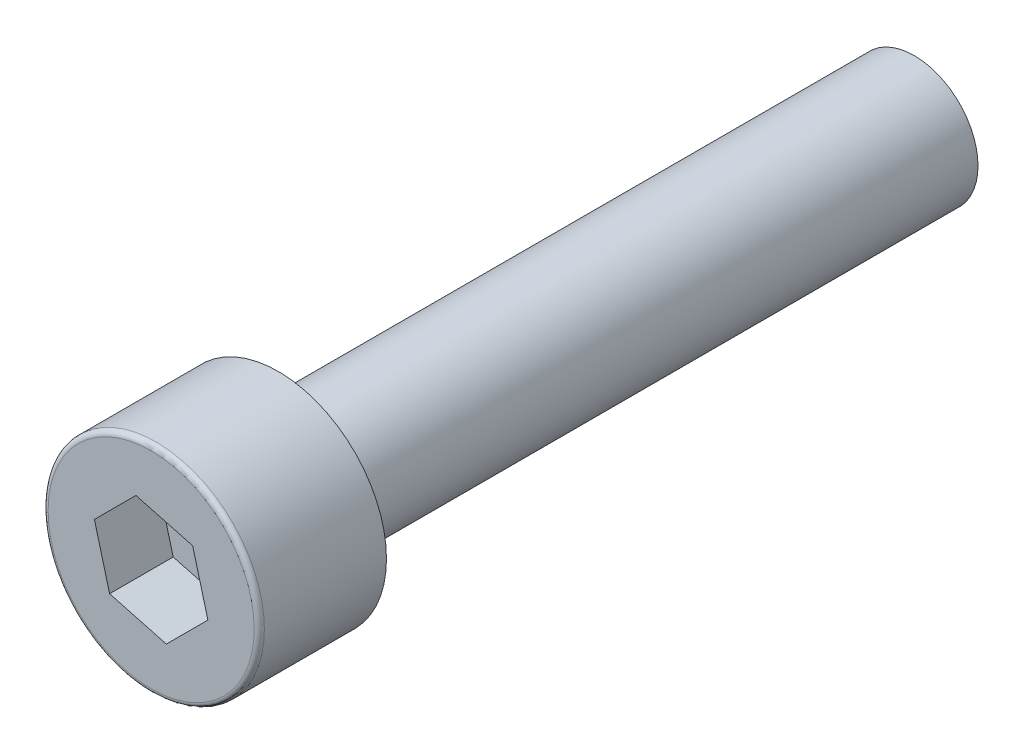
ISO-10303-21;
HEADER;
FILE_DESCRIPTION(('STEP AP214'),'2;1');
FILE_NAME('part.step','',(''),(''),'','','');
FILE_SCHEMA(('AUTOMOTIVE_DESIGN { 1 0 10303 214 1 1 1 1 }'));
ENDSEC;
DATA;
#1=APPLICATION_CONTEXT('core data for automotive mechanical design processes');
#2=APPLICATION_PROTOCOL_DEFINITION('international standard','automotive_design',2000,#1);
#3=PRODUCT_CONTEXT('',#1,'mechanical');
#4=PRODUCT('Part','Part','',(#3));
#5=PRODUCT_RELATED_PRODUCT_CATEGORY('part','',(#4));
#6=PRODUCT_DEFINITION_FORMATION('','',#4);
#7=PRODUCT_DEFINITION_CONTEXT('part definition',#1,'design');
#8=PRODUCT_DEFINITION('design','',#6,#7);
#9=PRODUCT_DEFINITION_SHAPE('','',#8);
#10=(LENGTH_UNIT() NAMED_UNIT(*) SI_UNIT(.MILLI.,.METRE.));
#11=(NAMED_UNIT(*) PLANE_ANGLE_UNIT() SI_UNIT($,.RADIAN.));
#12=(NAMED_UNIT(*) SI_UNIT($,.STERADIAN.) SOLID_ANGLE_UNIT());
#13=UNCERTAINTY_MEASURE_WITH_UNIT(LENGTH_MEASURE(1.E-05),#10,'distance_accuracy_value','');
#14=(GEOMETRIC_REPRESENTATION_CONTEXT(3) GLOBAL_UNCERTAINTY_ASSIGNED_CONTEXT((#13)) GLOBAL_UNIT_ASSIGNED_CONTEXT((#10,
#11,#12)) REPRESENTATION_CONTEXT('',''));
#15=CARTESIAN_POINT('',(0.,0.,0.));
#16=DIRECTION('',(0.,0.,1.));
#17=DIRECTION('',(1.,0.,0.));
#18=AXIS2_PLACEMENT_3D('',#15,#16,#17);
#19=CARTESIAN_POINT('',(0.,0.,0.));
#20=DIRECTION('',(0.,0.,1.));
#21=DIRECTION('',(1.,0.,0.));
#22=AXIS2_PLACEMENT_3D('',#19,#20,#21);
#23=PLANE('',#22);
#24=CARTESIAN_POINT('',(0.,0.,0.));
#25=DIRECTION('',(0.,0.,1.));
#26=DIRECTION('',(1.,0.,0.));
#27=AXIS2_PLACEMENT_3D('',#24,#25,#26);
#28=CIRCLE('',#27,4.25);
#29=CARTESIAN_POINT('',(4.25,0.,0.));
#30=VERTEX_POINT('',#29);
#31=EDGE_CURVE('E137',#30,#30,#28,.T.);
#32=ORIENTED_EDGE('',*,*,#31,.F.);
#33=EDGE_LOOP('',(#32));
#34=FACE_BOUND('',#33,.T.);
#35=CARTESIAN_POINT('',(0.,0.,0.));
#36=DIRECTION('',(0.,0.,1.));
#37=DIRECTION('',(1.,0.,0.));
#38=AXIS2_PLACEMENT_3D('',#35,#36,#37);
#39=CIRCLE('',#38,2.5);
#40=CARTESIAN_POINT('',(2.5,0.,0.));
#41=VERTEX_POINT('',#40);
#42=EDGE_CURVE('E145',#41,#41,#39,.F.);
#43=ORIENTED_EDGE('',*,*,#42,.F.);
#44=EDGE_LOOP('',(#43));
#45=FACE_BOUND('',#44,.T.);
#46=ADVANCED_FACE('F34',(#34,#45),#23,.F.);
#47=CARTESIAN_POINT('',(0.,0.,5.));
#48=DIRECTION('',(0.,0.,-1.));
#49=DIRECTION('',(-1.,0.,0.));
#50=AXIS2_PLACEMENT_3D('',#47,#48,#49);
#51=CYLINDRICAL_SURFACE('',#50,4.25);
#52=CARTESIAN_POINT('',(0.,0.,4.8));
#53=DIRECTION('',(0.,0.,1.));
#54=DIRECTION('',(1.,0.,0.));
#55=AXIS2_PLACEMENT_3D('',#52,#53,#54);
#56=CIRCLE('',#55,4.25);
#57=CARTESIAN_POINT('',(4.25,0.,4.8));
#58=VERTEX_POINT('',#57);
#59=EDGE_CURVE('E11',#58,#58,#56,.F.);
#60=ORIENTED_EDGE('',*,*,#59,.T.);
#61=EDGE_LOOP('',(#60));
#62=FACE_BOUND('',#61,.T.);
#63=ORIENTED_EDGE('',*,*,#31,.T.);
#64=EDGE_LOOP('',(#63));
#65=FACE_BOUND('',#64,.T.);
#66=ADVANCED_FACE('F164',(#62,#65),#51,.T.);
#67=CARTESIAN_POINT('',(0.,0.,5.));
#68=DIRECTION('',(0.,0.,1.));
#69=DIRECTION('',(1.,0.,0.));
#70=AXIS2_PLACEMENT_3D('',#67,#68,#69);
#71=PLANE('',#70);
#72=CARTESIAN_POINT('',(0.,0.,5.));
#73=DIRECTION('',(0.,0.,1.));
#74=DIRECTION('',(1.,0.,0.));
#75=AXIS2_PLACEMENT_3D('',#72,#73,#74);
#76=CIRCLE('',#75,4.05);
#77=CARTESIAN_POINT('',(4.05,0.,5.));
#78=VERTEX_POINT('',#77);
#79=EDGE_CURVE('E42',#78,#78,#76,.T.);
#80=ORIENTED_EDGE('',*,*,#79,.T.);
#81=EDGE_LOOP('',(#80));
#82=FACE_BOUND('',#81,.T.);
#83=DIRECTION('',(0.258819045102521,-0.965925826289068,0.));
#84=VECTOR('',#83,1.);
#85=CARTESIAN_POINT('',(-2.23071014330082,0.597716981445369,5.));
#86=LINE('',#85,#84);
#87=CARTESIAN_POINT('',(-2.23071014330082,0.597716981445369,5.));
#88=VERTEX_POINT('',#87);
#89=CARTESIAN_POINT('',(-1.63299316185545,-1.63299316185545,5.));
#90=VERTEX_POINT('',#89);
#91=EDGE_CURVE('E49',#88,#90,#86,.T.);
#92=ORIENTED_EDGE('',*,*,#91,.F.);
#93=DIRECTION('',(-0.707106781186547,-0.707106781186548,0.));
#94=VECTOR('',#93,1.);
#95=CARTESIAN_POINT('',(-0.597716981445369,2.23071014330082,5.));
#96=LINE('',#95,#94);
#97=CARTESIAN_POINT('',(-0.597716981445369,2.23071014330082,5.));
#98=VERTEX_POINT('',#97);
#99=EDGE_CURVE('E133',#98,#88,#96,.T.);
#100=ORIENTED_EDGE('',*,*,#99,.F.);
#101=DIRECTION('',(-0.965925826289068,0.258819045102521,0.));
#102=VECTOR('',#101,1.);
#103=CARTESIAN_POINT('',(1.63299316185545,1.63299316185545,5.));
#104=LINE('',#103,#102);
#105=CARTESIAN_POINT('',(1.63299316185545,1.63299316185545,5.));
#106=VERTEX_POINT('',#105);
#107=EDGE_CURVE('E131',#106,#98,#104,.T.);
#108=ORIENTED_EDGE('',*,*,#107,.F.);
#109=DIRECTION('',(-0.258819045102521,0.965925826289068,0.));
#110=VECTOR('',#109,1.);
#111=CARTESIAN_POINT('',(2.23071014330082,-0.597716981445369,5.));
#112=LINE('',#111,#110);
#113=CARTESIAN_POINT('',(2.23071014330082,-0.597716981445369,5.));
#114=VERTEX_POINT('',#113);
#115=EDGE_CURVE('E97',#114,#106,#112,.T.);
#116=ORIENTED_EDGE('',*,*,#115,.F.);
#117=DIRECTION('',(0.707106781186547,0.707106781186547,0.));
#118=VECTOR('',#117,1.);
#119=CARTESIAN_POINT('',(0.597716981445369,-2.23071014330082,5.));
#120=LINE('',#119,#118);
#121=CARTESIAN_POINT('',(0.597716981445369,-2.23071014330082,5.));
#122=VERTEX_POINT('',#121);
#123=EDGE_CURVE('E127',#122,#114,#120,.T.);
#124=ORIENTED_EDGE('',*,*,#123,.F.);
#125=DIRECTION('',(0.965925826289068,-0.258819045102521,0.));
#126=VECTOR('',#125,1.);
#127=CARTESIAN_POINT('',(-1.63299316185545,-1.63299316185545,5.));
#128=LINE('',#127,#126);
#129=EDGE_CURVE('E123',#90,#122,#128,.T.);
#130=ORIENTED_EDGE('',*,*,#129,.F.);
#131=EDGE_LOOP('',(#92,#100,#108,#116,#124,#130));
#132=FACE_BOUND('',#131,.T.);
#133=ADVANCED_FACE('F150',(#82,#132),#71,.T.);
#134=CARTESIAN_POINT('',(-2.23071014330082,0.597716981445369,2.5));
#135=DIRECTION('',(-0.965925826289068,-0.258819045102521,0.));
#136=DIRECTION('',(0.258819045102521,-0.965925826289068,0.));
#137=AXIS2_PLACEMENT_3D('',#134,#135,#136);
#138=PLANE('',#137);
#139=ORIENTED_EDGE('',*,*,#91,.T.);
#140=DIRECTION('',(0.,0.,1.));
#141=VECTOR('',#140,1.);
#142=CARTESIAN_POINT('',(-1.63299316185545,-1.63299316185545,2.5));
#143=LINE('',#142,#141);
#144=CARTESIAN_POINT('',(-1.63299316185545,-1.63299316185545,2.5));
#145=VERTEX_POINT('',#144);
#146=EDGE_CURVE('E79',#145,#90,#143,.T.);
#147=ORIENTED_EDGE('',*,*,#146,.F.);
#148=DIRECTION('',(0.258819045102521,-0.965925826289068,0.));
#149=VECTOR('',#148,1.);
#150=CARTESIAN_POINT('',(-2.23071014330082,0.597716981445369,2.5));
#151=LINE('',#150,#149);
#152=CARTESIAN_POINT('',(-2.23071014330082,0.597716981445369,2.5));
#153=VERTEX_POINT('',#152);
#154=EDGE_CURVE('E135',#153,#145,#151,.T.);
#155=ORIENTED_EDGE('',*,*,#154,.F.);
#156=DIRECTION('',(0.,0.,1.));
#157=VECTOR('',#156,1.);
#158=CARTESIAN_POINT('',(-2.23071014330082,0.597716981445369,2.5));
#159=LINE('',#158,#157);
#160=EDGE_CURVE('E57',#153,#88,#159,.T.);
#161=ORIENTED_EDGE('',*,*,#160,.T.);
#162=EDGE_LOOP('',(#139,#147,#155,#161));
#163=FACE_BOUND('',#162,.T.);
#164=ADVANCED_FACE('F176',(#163),#138,.F.);
#165=CARTESIAN_POINT('',(-0.597716981445369,2.23071014330082,2.5));
#166=DIRECTION('',(-0.707106781186548,0.707106781186547,0.));
#167=DIRECTION('',(-0.707106781186547,-0.707106781186548,0.));
#168=AXIS2_PLACEMENT_3D('',#165,#166,#167);
#169=PLANE('',#168);
#170=ORIENTED_EDGE('',*,*,#99,.T.);
#171=ORIENTED_EDGE('',*,*,#160,.F.);
#172=DIRECTION('',(-0.707106781186547,-0.707106781186548,0.));
#173=VECTOR('',#172,1.);
#174=CARTESIAN_POINT('',(-0.597716981445369,2.23071014330082,2.5));
#175=LINE('',#174,#173);
#176=CARTESIAN_POINT('',(-0.597716981445369,2.23071014330082,2.5));
#177=VERTEX_POINT('',#176);
#178=EDGE_CURVE('E109',#177,#153,#175,.T.);
#179=ORIENTED_EDGE('',*,*,#178,.F.);
#180=DIRECTION('',(0.,0.,1.));
#181=VECTOR('',#180,1.);
#182=CARTESIAN_POINT('',(-0.597716981445369,2.23071014330082,2.5));
#183=LINE('',#182,#181);
#184=EDGE_CURVE('E101',#177,#98,#183,.T.);
#185=ORIENTED_EDGE('',*,*,#184,.T.);
#186=EDGE_LOOP('',(#170,#171,#179,#185));
#187=FACE_BOUND('',#186,.T.);
#188=ADVANCED_FACE('F179',(#187),#169,.F.);
#189=CARTESIAN_POINT('',(1.63299316185545,1.63299316185545,2.5));
#190=DIRECTION('',(0.258819045102521,0.965925826289068,0.));
#191=DIRECTION('',(-0.965925826289068,0.258819045102521,0.));
#192=AXIS2_PLACEMENT_3D('',#189,#190,#191);
#193=PLANE('',#192);
#194=ORIENTED_EDGE('',*,*,#107,.T.);
#195=ORIENTED_EDGE('',*,*,#184,.F.);
#196=DIRECTION('',(-0.965925826289068,0.258819045102521,0.));
#197=VECTOR('',#196,1.);
#198=CARTESIAN_POINT('',(1.63299316185545,1.63299316185545,2.5));
#199=LINE('',#198,#197);
#200=CARTESIAN_POINT('',(1.63299316185545,1.63299316185545,2.5));
#201=VERTEX_POINT('',#200);
#202=EDGE_CURVE('E105',#201,#177,#199,.T.);
#203=ORIENTED_EDGE('',*,*,#202,.F.);
#204=DIRECTION('',(0.,0.,1.));
#205=VECTOR('',#204,1.);
#206=CARTESIAN_POINT('',(1.63299316185545,1.63299316185545,2.5));
#207=LINE('',#206,#205);
#208=EDGE_CURVE('E90',#201,#106,#207,.T.);
#209=ORIENTED_EDGE('',*,*,#208,.T.);
#210=EDGE_LOOP('',(#194,#195,#203,#209));
#211=FACE_BOUND('',#210,.T.);
#212=ADVANCED_FACE('F106',(#211),#193,.F.);
#213=CARTESIAN_POINT('',(2.23071014330082,-0.597716981445369,2.5));
#214=DIRECTION('',(0.965925826289068,0.258819045102521,0.));
#215=DIRECTION('',(-0.258819045102521,0.965925826289068,0.));
#216=AXIS2_PLACEMENT_3D('',#213,#214,#215);
#217=PLANE('',#216);
#218=ORIENTED_EDGE('',*,*,#115,.T.);
#219=ORIENTED_EDGE('',*,*,#208,.F.);
#220=DIRECTION('',(-0.258819045102521,0.965925826289068,0.));
#221=VECTOR('',#220,1.);
#222=CARTESIAN_POINT('',(2.23071014330082,-0.597716981445369,2.5));
#223=LINE('',#222,#221);
#224=CARTESIAN_POINT('',(2.23071014330082,-0.597716981445369,2.5));
#225=VERTEX_POINT('',#224);
#226=EDGE_CURVE('E94',#225,#201,#223,.T.);
#227=ORIENTED_EDGE('',*,*,#226,.F.);
#228=DIRECTION('',(0.,0.,1.));
#229=VECTOR('',#228,1.);
#230=CARTESIAN_POINT('',(2.23071014330082,-0.597716981445369,2.5));
#231=LINE('',#230,#229);
#232=EDGE_CURVE('E102',#225,#114,#231,.T.);
#233=ORIENTED_EDGE('',*,*,#232,.T.);
#234=EDGE_LOOP('',(#218,#219,#227,#233));
#235=FACE_BOUND('',#234,.T.);
#236=ADVANCED_FACE('F92',(#235),#217,.F.);
#237=CARTESIAN_POINT('',(0.597716981445369,-2.23071014330082,2.5));
#238=DIRECTION('',(0.707106781186548,-0.707106781186548,0.));
#239=DIRECTION('',(0.707106781186548,0.707106781186548,0.));
#240=AXIS2_PLACEMENT_3D('',#237,#238,#239);
#241=PLANE('',#240);
#242=ORIENTED_EDGE('',*,*,#123,.T.);
#243=ORIENTED_EDGE('',*,*,#232,.F.);
#244=DIRECTION('',(0.707106781186547,0.707106781186547,0.));
#245=VECTOR('',#244,1.);
#246=CARTESIAN_POINT('',(0.597716981445369,-2.23071014330082,2.5));
#247=LINE('',#246,#245);
#248=CARTESIAN_POINT('',(0.597716981445369,-2.23071014330082,2.5));
#249=VERTEX_POINT('',#248);
#250=EDGE_CURVE('E115',#249,#225,#247,.T.);
#251=ORIENTED_EDGE('',*,*,#250,.F.);
#252=DIRECTION('',(0.,0.,1.));
#253=VECTOR('',#252,1.);
#254=CARTESIAN_POINT('',(0.597716981445369,-2.23071014330082,2.5));
#255=LINE('',#254,#253);
#256=EDGE_CURVE('E140',#249,#122,#255,.T.);
#257=ORIENTED_EDGE('',*,*,#256,.T.);
#258=EDGE_LOOP('',(#242,#243,#251,#257));
#259=FACE_BOUND('',#258,.T.);
#260=ADVANCED_FACE('F183',(#259),#241,.F.);
#261=CARTESIAN_POINT('',(-1.63299316185545,-1.63299316185545,2.5));
#262=DIRECTION('',(-0.258819045102521,-0.965925826289068,0.));
#263=DIRECTION('',(0.965925826289068,-0.258819045102521,0.));
#264=AXIS2_PLACEMENT_3D('',#261,#262,#263);
#265=PLANE('',#264);
#266=ORIENTED_EDGE('',*,*,#129,.T.);
#267=ORIENTED_EDGE('',*,*,#256,.F.);
#268=DIRECTION('',(0.965925826289068,-0.258819045102521,0.));
#269=VECTOR('',#268,1.);
#270=CARTESIAN_POINT('',(-1.63299316185545,-1.63299316185545,2.5));
#271=LINE('',#270,#269);
#272=EDGE_CURVE('E117',#145,#249,#271,.T.);
#273=ORIENTED_EDGE('',*,*,#272,.F.);
#274=ORIENTED_EDGE('',*,*,#146,.T.);
#275=EDGE_LOOP('',(#266,#267,#273,#274));
#276=FACE_BOUND('',#275,.T.);
#277=ADVANCED_FACE('F180',(#276),#265,.F.);
#278=CARTESIAN_POINT('',(0.,0.,2.5));
#279=DIRECTION('',(0.,0.,1.));
#280=DIRECTION('',(1.,0.,0.));
#281=AXIS2_PLACEMENT_3D('',#278,#279,#280);
#282=PLANE('',#281);
#283=ORIENTED_EDGE('',*,*,#154,.T.);
#284=ORIENTED_EDGE('',*,*,#272,.T.);
#285=ORIENTED_EDGE('',*,*,#250,.T.);
#286=ORIENTED_EDGE('',*,*,#226,.T.);
#287=ORIENTED_EDGE('',*,*,#202,.T.);
#288=ORIENTED_EDGE('',*,*,#178,.T.);
#289=EDGE_LOOP('',(#283,#284,#285,#286,#287,#288));
#290=FACE_BOUND('',#289,.T.);
#291=ADVANCED_FACE('F112',(#290),#282,.T.);
#292=CARTESIAN_POINT('',(0.,0.,-25.));
#293=DIRECTION('',(0.,0.,1.));
#294=DIRECTION('',(1.,0.,0.));
#295=AXIS2_PLACEMENT_3D('',#292,#293,#294);
#296=CYLINDRICAL_SURFACE('',#295,2.5);
#297=CARTESIAN_POINT('',(0.,0.,-25.));
#298=DIRECTION('',(0.,0.,-1.));
#299=DIRECTION('',(-1.,0.,0.));
#300=AXIS2_PLACEMENT_3D('',#297,#298,#299);
#301=CIRCLE('',#300,2.5);
#302=CARTESIAN_POINT('',(-2.5,0.,-25.));
#303=VERTEX_POINT('',#302);
#304=EDGE_CURVE('E124',#303,#303,#301,.T.);
#305=ORIENTED_EDGE('',*,*,#304,.F.);
#306=EDGE_LOOP('',(#305));
#307=FACE_BOUND('',#306,.T.);
#308=ORIENTED_EDGE('',*,*,#42,.T.);
#309=EDGE_LOOP('',(#308));
#310=FACE_BOUND('',#309,.T.);
#311=ADVANCED_FACE('F159',(#307,#310),#296,.T.);
#312=CARTESIAN_POINT('',(0.,0.,-25.));
#313=DIRECTION('',(0.,0.,-1.));
#314=DIRECTION('',(-1.,0.,0.));
#315=AXIS2_PLACEMENT_3D('',#312,#313,#314);
#316=PLANE('',#315);
#317=ORIENTED_EDGE('',*,*,#304,.T.);
#318=EDGE_LOOP('',(#317));
#319=FACE_BOUND('',#318,.T.);
#320=ADVANCED_FACE('F154',(#319),#316,.T.);
#321=CARTESIAN_POINT('',(0.,0.,4.8));
#322=DIRECTION('',(0.,0.,1.));
#323=DIRECTION('',(1.,0.,0.));
#324=AXIS2_PLACEMENT_3D('',#321,#322,#323);
#325=TOROIDAL_SURFACE('',#324,4.05,0.2);
#326=ORIENTED_EDGE('',*,*,#59,.F.);
#327=EDGE_LOOP('',(#326));
#328=FACE_BOUND('',#327,.T.);
#329=ORIENTED_EDGE('',*,*,#79,.F.);
#330=EDGE_LOOP('',(#329));
#331=FACE_BOUND('',#330,.T.);
#332=ADVANCED_FACE('F36',(#328,#331),#325,.T.);
#333=CLOSED_SHELL('',(#46,#66,#133,#164,#188,#212,#236,#260,#277,#291,#311,#320,#332));
#334=MANIFOLD_SOLID_BREP('B2',#333);
#335=ADVANCED_BREP_SHAPE_REPRESENTATION('',(#18,#334),#14);
#336=SHAPE_DEFINITION_REPRESENTATION(#9,#335);
ENDSEC;
END-ISO-10303-21;
